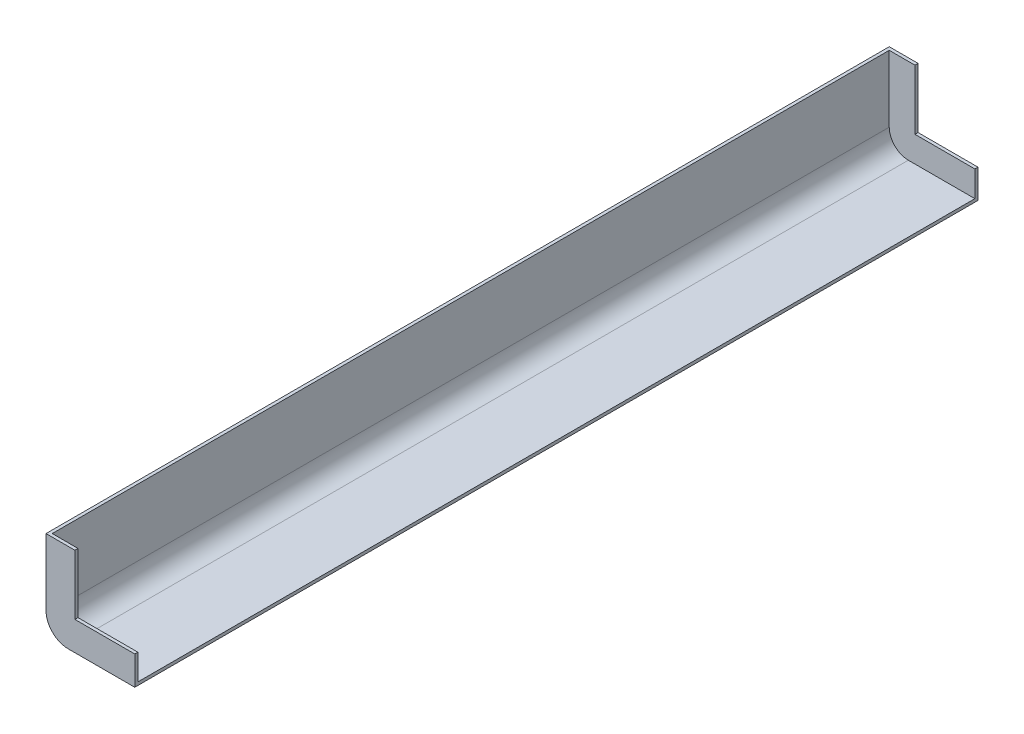
ISO-10303-21;
HEADER;
FILE_DESCRIPTION(('STEP AP214'),'2;1');
FILE_NAME('part.step','',(''),(''),'','','');
FILE_SCHEMA(('AUTOMOTIVE_DESIGN { 1 0 10303 214 1 1 1 1 }'));
ENDSEC;
DATA;
#1=APPLICATION_CONTEXT('core data for automotive mechanical design processes');
#2=APPLICATION_PROTOCOL_DEFINITION('international standard','automotive_design',2000,#1);
#3=PRODUCT_CONTEXT('',#1,'mechanical');
#4=PRODUCT('Part','Part','',(#3));
#5=PRODUCT_RELATED_PRODUCT_CATEGORY('part','',(#4));
#6=PRODUCT_DEFINITION_FORMATION('','',#4);
#7=PRODUCT_DEFINITION_CONTEXT('part definition',#1,'design');
#8=PRODUCT_DEFINITION('design','',#6,#7);
#9=PRODUCT_DEFINITION_SHAPE('','',#8);
#10=(LENGTH_UNIT() NAMED_UNIT(*) SI_UNIT(.MILLI.,.METRE.));
#11=(NAMED_UNIT(*) PLANE_ANGLE_UNIT() SI_UNIT($,.RADIAN.));
#12=(NAMED_UNIT(*) SI_UNIT($,.STERADIAN.) SOLID_ANGLE_UNIT());
#13=UNCERTAINTY_MEASURE_WITH_UNIT(LENGTH_MEASURE(1.E-05),#10,'distance_accuracy_value','');
#14=(GEOMETRIC_REPRESENTATION_CONTEXT(3) GLOBAL_UNCERTAINTY_ASSIGNED_CONTEXT((#13)) GLOBAL_UNIT_ASSIGNED_CONTEXT((#10,
#11,#12)) REPRESENTATION_CONTEXT('',''));
#15=CARTESIAN_POINT('',(0.,0.,0.));
#16=DIRECTION('',(0.,0.,1.));
#17=DIRECTION('',(1.,0.,0.));
#18=AXIS2_PLACEMENT_3D('',#15,#16,#17);
#19=CARTESIAN_POINT('',(16.51,50.8,482.6));
#20=DIRECTION('',(0.,-1.,0.));
#21=DIRECTION('',(0.,0.,-1.));
#22=AXIS2_PLACEMENT_3D('',#19,#20,#21);
#23=PLANE('',#22);
#24=DIRECTION('',(-1.,0.,0.));
#25=VECTOR('',#24,1.);
#26=CARTESIAN_POINT('',(16.51,50.8,1.778));
#27=LINE('',#26,#25);
#28=CARTESIAN_POINT('',(16.51,50.8,1.778));
#29=VERTEX_POINT('',#28);
#30=CARTESIAN_POINT('',(1.778,50.8,1.778));
#31=VERTEX_POINT('',#30);
#32=EDGE_CURVE('E237',#29,#31,#27,.T.);
#33=ORIENTED_EDGE('',*,*,#32,.F.);
#34=DIRECTION('',(0.,0.,-1.));
#35=VECTOR('',#34,1.);
#36=CARTESIAN_POINT('',(16.51,50.8,482.6));
#37=LINE('',#36,#35);
#38=CARTESIAN_POINT('',(16.51,50.8,0.));
#39=VERTEX_POINT('',#38);
#40=EDGE_CURVE('E94',#29,#39,#37,.T.);
#41=ORIENTED_EDGE('',*,*,#40,.T.);
#42=DIRECTION('',(-1.,0.,0.));
#43=VECTOR('',#42,1.);
#44=CARTESIAN_POINT('',(16.51,50.8,0.));
#45=LINE('',#44,#43);
#46=CARTESIAN_POINT('',(0.,50.8,0.));
#47=VERTEX_POINT('',#46);
#48=EDGE_CURVE('E152',#39,#47,#45,.T.);
#49=ORIENTED_EDGE('',*,*,#48,.T.);
#50=DIRECTION('',(0.,0.,-1.));
#51=VECTOR('',#50,1.);
#52=CARTESIAN_POINT('',(0.,50.8,482.6));
#53=LINE('',#52,#51);
#54=CARTESIAN_POINT('',(0.,50.8,482.6));
#55=VERTEX_POINT('',#54);
#56=EDGE_CURVE('E11',#55,#47,#53,.T.);
#57=ORIENTED_EDGE('',*,*,#56,.F.);
#58=DIRECTION('',(-1.,0.,0.));
#59=VECTOR('',#58,1.);
#60=CARTESIAN_POINT('',(16.51,50.8,482.6));
#61=LINE('',#60,#59);
#62=CARTESIAN_POINT('',(16.51,50.8,482.6));
#63=VERTEX_POINT('',#62);
#64=EDGE_CURVE('E176',#63,#55,#61,.T.);
#65=ORIENTED_EDGE('',*,*,#64,.F.);
#66=CARTESIAN_POINT('',(16.51,50.8,480.822));
#67=VERTEX_POINT('',#66);
#68=EDGE_CURVE('E177',#63,#67,#37,.T.);
#69=ORIENTED_EDGE('',*,*,#68,.T.);
#70=DIRECTION('',(-1.,0.,0.));
#71=VECTOR('',#70,1.);
#72=CARTESIAN_POINT('',(16.51,50.8,480.822));
#73=LINE('',#72,#71);
#74=CARTESIAN_POINT('',(1.778,50.8,480.822));
#75=VERTEX_POINT('',#74);
#76=EDGE_CURVE('E54',#67,#75,#73,.T.);
#77=ORIENTED_EDGE('',*,*,#76,.T.);
#78=DIRECTION('',(0.,0.,-1.));
#79=VECTOR('',#78,1.);
#80=CARTESIAN_POINT('',(1.778,50.8,482.6));
#81=LINE('',#80,#79);
#82=EDGE_CURVE('E156',#75,#31,#81,.T.);
#83=ORIENTED_EDGE('',*,*,#82,.T.);
#84=EDGE_LOOP('',(#33,#41,#49,#57,#65,#69,#77,#83));
#85=FACE_BOUND('',#84,.T.);
#86=ADVANCED_FACE('F39',(#85),#23,.F.);
#87=CARTESIAN_POINT('',(50.8,0.,482.6));
#88=DIRECTION('',(-1.,0.,0.));
#89=DIRECTION('',(0.,0.,1.));
#90=AXIS2_PLACEMENT_3D('',#87,#88,#89);
#91=PLANE('',#90);
#92=DIRECTION('',(0.,1.,0.));
#93=VECTOR('',#92,1.);
#94=CARTESIAN_POINT('',(50.8,0.,1.778));
#95=LINE('',#94,#93);
#96=CARTESIAN_POINT('',(50.8,1.778,1.778));
#97=VERTEX_POINT('',#96);
#98=CARTESIAN_POINT('',(50.8,16.51,1.778));
#99=VERTEX_POINT('',#98);
#100=EDGE_CURVE('E233',#97,#99,#95,.T.);
#101=ORIENTED_EDGE('',*,*,#100,.F.);
#102=DIRECTION('',(0.,0.,-1.));
#103=VECTOR('',#102,1.);
#104=CARTESIAN_POINT('',(50.8,1.778,482.6));
#105=LINE('',#104,#103);
#106=CARTESIAN_POINT('',(50.8,1.778,480.822));
#107=VERTEX_POINT('',#106);
#108=EDGE_CURVE('E258',#107,#97,#105,.T.);
#109=ORIENTED_EDGE('',*,*,#108,.F.);
#110=DIRECTION('',(0.,1.,0.));
#111=VECTOR('',#110,1.);
#112=CARTESIAN_POINT('',(50.8,0.,480.822));
#113=LINE('',#112,#111);
#114=CARTESIAN_POINT('',(50.8,16.51,480.822));
#115=VERTEX_POINT('',#114);
#116=EDGE_CURVE('E136',#107,#115,#113,.T.);
#117=ORIENTED_EDGE('',*,*,#116,.T.);
#118=DIRECTION('',(0.,0.,-1.));
#119=VECTOR('',#118,1.);
#120=CARTESIAN_POINT('',(50.8,16.51,482.6));
#121=LINE('',#120,#119);
#122=CARTESIAN_POINT('',(50.8,16.51,482.6));
#123=VERTEX_POINT('',#122);
#124=EDGE_CURVE('E130',#123,#115,#121,.T.);
#125=ORIENTED_EDGE('',*,*,#124,.F.);
#126=DIRECTION('',(0.,1.,0.));
#127=VECTOR('',#126,1.);
#128=CARTESIAN_POINT('',(50.8,0.,482.6));
#129=LINE('',#128,#127);
#130=CARTESIAN_POINT('',(50.8,0.,482.6));
#131=VERTEX_POINT('',#130);
#132=EDGE_CURVE('E115',#131,#123,#129,.T.);
#133=ORIENTED_EDGE('',*,*,#132,.F.);
#134=DIRECTION('',(0.,0.,-1.));
#135=VECTOR('',#134,1.);
#136=CARTESIAN_POINT('',(50.8,0.,482.6));
#137=LINE('',#136,#135);
#138=CARTESIAN_POINT('',(50.8,0.,0.));
#139=VERTEX_POINT('',#138);
#140=EDGE_CURVE('E140',#131,#139,#137,.T.);
#141=ORIENTED_EDGE('',*,*,#140,.T.);
#142=DIRECTION('',(0.,1.,0.));
#143=VECTOR('',#142,1.);
#144=CARTESIAN_POINT('',(50.8,0.,0.));
#145=LINE('',#144,#143);
#146=CARTESIAN_POINT('',(50.8,16.51,0.));
#147=VERTEX_POINT('',#146);
#148=EDGE_CURVE('E165',#139,#147,#145,.T.);
#149=ORIENTED_EDGE('',*,*,#148,.T.);
#150=EDGE_CURVE('E141',#99,#147,#121,.T.);
#151=ORIENTED_EDGE('',*,*,#150,.F.);
#152=EDGE_LOOP('',(#101,#109,#117,#125,#133,#141,#149,#151));
#153=FACE_BOUND('',#152,.T.);
#154=ADVANCED_FACE('F132',(#153),#91,.F.);
#155=CARTESIAN_POINT('',(50.8,16.51,482.6));
#156=DIRECTION('',(0.,-1.,0.));
#157=DIRECTION('',(1.,0.,0.));
#158=AXIS2_PLACEMENT_3D('',#155,#156,#157);
#159=PLANE('',#158);
#160=DIRECTION('',(-1.,0.,0.));
#161=VECTOR('',#160,1.);
#162=CARTESIAN_POINT('',(50.8,16.51,1.778));
#163=LINE('',#162,#161);
#164=CARTESIAN_POINT('',(16.51,16.51,1.778));
#165=VERTEX_POINT('',#164);
#166=EDGE_CURVE('E214',#99,#165,#163,.T.);
#167=ORIENTED_EDGE('',*,*,#166,.F.);
#168=ORIENTED_EDGE('',*,*,#150,.T.);
#169=DIRECTION('',(-1.,0.,0.));
#170=VECTOR('',#169,1.);
#171=CARTESIAN_POINT('',(50.8,16.51,0.));
#172=LINE('',#171,#170);
#173=CARTESIAN_POINT('',(16.51,16.51,0.));
#174=VERTEX_POINT('',#173);
#175=EDGE_CURVE('E169',#147,#174,#172,.T.);
#176=ORIENTED_EDGE('',*,*,#175,.T.);
#177=DIRECTION('',(0.,0.,-1.));
#178=VECTOR('',#177,1.);
#179=CARTESIAN_POINT('',(16.51,16.51,482.6));
#180=LINE('',#179,#178);
#181=EDGE_CURVE('E181',#165,#174,#180,.T.);
#182=ORIENTED_EDGE('',*,*,#181,.F.);
#183=EDGE_LOOP('',(#167,#168,#176,#182));
#184=FACE_BOUND('',#183,.T.);
#185=ADVANCED_FACE('F211',(#184),#159,.F.);
#186=CARTESIAN_POINT('',(16.51,16.51,482.6));
#187=DIRECTION('',(-1.,0.,0.));
#188=DIRECTION('',(0.,-1.,0.));
#189=AXIS2_PLACEMENT_3D('',#186,#187,#188);
#190=PLANE('',#189);
#191=DIRECTION('',(0.,1.,0.));
#192=VECTOR('',#191,1.);
#193=CARTESIAN_POINT('',(16.51,16.51,1.778));
#194=LINE('',#193,#192);
#195=EDGE_CURVE('E222',#165,#29,#194,.T.);
#196=ORIENTED_EDGE('',*,*,#195,.F.);
#197=ORIENTED_EDGE('',*,*,#181,.T.);
#198=DIRECTION('',(0.,1.,0.));
#199=VECTOR('',#198,1.);
#200=CARTESIAN_POINT('',(16.51,16.51,0.));
#201=LINE('',#200,#199);
#202=EDGE_CURVE('E173',#174,#39,#201,.T.);
#203=ORIENTED_EDGE('',*,*,#202,.T.);
#204=ORIENTED_EDGE('',*,*,#40,.F.);
#205=EDGE_LOOP('',(#196,#197,#203,#204));
#206=FACE_BOUND('',#205,.T.);
#207=ADVANCED_FACE('F220',(#206),#190,.F.);
#208=CARTESIAN_POINT('',(0.,12.7000000000001,482.6));
#209=DIRECTION('',(1.,0.,0.));
#210=DIRECTION('',(0.,0.,-1.));
#211=AXIS2_PLACEMENT_3D('',#208,#209,#210);
#212=PLANE('',#211);
#213=DIRECTION('',(0.,-1.,0.));
#214=VECTOR('',#213,1.);
#215=CARTESIAN_POINT('',(0.,12.7000000000001,0.));
#216=LINE('',#215,#214);
#217=CARTESIAN_POINT('',(0.,12.7000000000001,0.));
#218=VERTEX_POINT('',#217);
#219=EDGE_CURVE('E155',#47,#218,#216,.T.);
#220=ORIENTED_EDGE('',*,*,#219,.T.);
#221=DIRECTION('',(0.,0.,-1.));
#222=VECTOR('',#221,1.);
#223=CARTESIAN_POINT('',(0.,12.7000000000001,482.6));
#224=LINE('',#223,#222);
#225=CARTESIAN_POINT('',(0.,12.7000000000001,482.6));
#226=VERTEX_POINT('',#225);
#227=EDGE_CURVE('E47',#226,#218,#224,.T.);
#228=ORIENTED_EDGE('',*,*,#227,.F.);
#229=DIRECTION('',(0.,-1.,0.));
#230=VECTOR('',#229,1.);
#231=CARTESIAN_POINT('',(0.,12.7000000000001,482.6));
#232=LINE('',#231,#230);
#233=EDGE_CURVE('E102',#55,#226,#232,.T.);
#234=ORIENTED_EDGE('',*,*,#233,.F.);
#235=ORIENTED_EDGE('',*,*,#56,.T.);
#236=EDGE_LOOP('',(#220,#228,#234,#235));
#237=FACE_BOUND('',#236,.T.);
#238=ADVANCED_FACE('F355',(#237),#212,.F.);
#239=CARTESIAN_POINT('',(12.7,12.7,482.6));
#240=DIRECTION('',(0.,0.,-1.));
#241=DIRECTION('',(-1.,0.,0.));
#242=AXIS2_PLACEMENT_3D('',#239,#240,#241);
#243=CYLINDRICAL_SURFACE('',#242,12.7);
#244=CARTESIAN_POINT('',(12.7,12.7,0.));
#245=DIRECTION('',(0.,0.,1.));
#246=DIRECTION('',(1.,0.,0.));
#247=AXIS2_PLACEMENT_3D('',#244,#245,#246);
#248=CIRCLE('',#247,12.7);
#249=CARTESIAN_POINT('',(12.7000000000001,0.,0.));
#250=VERTEX_POINT('',#249);
#251=EDGE_CURVE('E159',#218,#250,#248,.T.);
#252=ORIENTED_EDGE('',*,*,#251,.T.);
#253=DIRECTION('',(0.,0.,-1.));
#254=VECTOR('',#253,1.);
#255=CARTESIAN_POINT('',(12.7000000000001,0.,482.6));
#256=LINE('',#255,#254);
#257=CARTESIAN_POINT('',(12.7000000000001,0.,482.6));
#258=VERTEX_POINT('',#257);
#259=EDGE_CURVE('E186',#258,#250,#256,.T.);
#260=ORIENTED_EDGE('',*,*,#259,.F.);
#261=CARTESIAN_POINT('',(12.7,12.7,482.6));
#262=DIRECTION('',(0.,0.,1.));
#263=DIRECTION('',(1.,0.,0.));
#264=AXIS2_PLACEMENT_3D('',#261,#262,#263);
#265=CIRCLE('',#264,12.7);
#266=EDGE_CURVE('E196',#226,#258,#265,.T.);
#267=ORIENTED_EDGE('',*,*,#266,.F.);
#268=ORIENTED_EDGE('',*,*,#227,.T.);
#269=EDGE_LOOP('',(#252,#260,#267,#268));
#270=FACE_BOUND('',#269,.T.);
#271=ADVANCED_FACE('F194',(#270),#243,.T.);
#272=CARTESIAN_POINT('',(12.7000000000001,0.,482.6));
#273=DIRECTION('',(0.,1.,0.));
#274=DIRECTION('',(0.,0.,1.));
#275=AXIS2_PLACEMENT_3D('',#272,#273,#274);
#276=PLANE('',#275);
#277=DIRECTION('',(1.,0.,0.));
#278=VECTOR('',#277,1.);
#279=CARTESIAN_POINT('',(12.7000000000001,0.,0.));
#280=LINE('',#279,#278);
#281=EDGE_CURVE('E162',#250,#139,#280,.T.);
#282=ORIENTED_EDGE('',*,*,#281,.T.);
#283=ORIENTED_EDGE('',*,*,#140,.F.);
#284=DIRECTION('',(1.,0.,0.));
#285=VECTOR('',#284,1.);
#286=CARTESIAN_POINT('',(12.7000000000001,0.,482.6));
#287=LINE('',#286,#285);
#288=EDGE_CURVE('E122',#258,#131,#287,.T.);
#289=ORIENTED_EDGE('',*,*,#288,.F.);
#290=ORIENTED_EDGE('',*,*,#259,.T.);
#291=EDGE_LOOP('',(#282,#283,#289,#290));
#292=FACE_BOUND('',#291,.T.);
#293=ADVANCED_FACE('F204',(#292),#276,.F.);
#294=ORIENTED_EDGE('',*,*,#124,.T.);
#295=DIRECTION('',(-1.,0.,0.));
#296=VECTOR('',#295,1.);
#297=CARTESIAN_POINT('',(50.8,16.51,480.822));
#298=LINE('',#297,#296);
#299=CARTESIAN_POINT('',(16.51,16.51,480.822));
#300=VERTEX_POINT('',#299);
#301=EDGE_CURVE('E265',#115,#300,#298,.T.);
#302=ORIENTED_EDGE('',*,*,#301,.T.);
#303=CARTESIAN_POINT('',(16.51,16.51,482.6));
#304=VERTEX_POINT('',#303);
#305=EDGE_CURVE('E145',#304,#300,#180,.T.);
#306=ORIENTED_EDGE('',*,*,#305,.F.);
#307=DIRECTION('',(-1.,0.,0.));
#308=VECTOR('',#307,1.);
#309=CARTESIAN_POINT('',(50.8,16.51,482.6));
#310=LINE('',#309,#308);
#311=EDGE_CURVE('E119',#123,#304,#310,.T.);
#312=ORIENTED_EDGE('',*,*,#311,.F.);
#313=EDGE_LOOP('',(#294,#302,#306,#312));
#314=FACE_BOUND('',#313,.T.);
#315=ADVANCED_FACE('F143',(#314),#159,.F.);
#316=ORIENTED_EDGE('',*,*,#305,.T.);
#317=DIRECTION('',(0.,1.,0.));
#318=VECTOR('',#317,1.);
#319=CARTESIAN_POINT('',(16.51,16.51,480.822));
#320=LINE('',#319,#318);
#321=EDGE_CURVE('E262',#300,#67,#320,.T.);
#322=ORIENTED_EDGE('',*,*,#321,.T.);
#323=ORIENTED_EDGE('',*,*,#68,.F.);
#324=DIRECTION('',(0.,1.,0.));
#325=VECTOR('',#324,1.);
#326=CARTESIAN_POINT('',(16.51,16.51,482.6));
#327=LINE('',#326,#325);
#328=EDGE_CURVE('E63',#304,#63,#327,.T.);
#329=ORIENTED_EDGE('',*,*,#328,.F.);
#330=EDGE_LOOP('',(#316,#322,#323,#329));
#331=FACE_BOUND('',#330,.T.);
#332=ADVANCED_FACE('F344',(#331),#190,.F.);
#333=CARTESIAN_POINT('',(12.7,12.7,482.6));
#334=DIRECTION('',(0.,0.,1.));
#335=DIRECTION('',(1.,0.,0.));
#336=AXIS2_PLACEMENT_3D('',#333,#334,#335);
#337=PLANE('',#336);
#338=ORIENTED_EDGE('',*,*,#64,.T.);
#339=ORIENTED_EDGE('',*,*,#233,.T.);
#340=ORIENTED_EDGE('',*,*,#266,.T.);
#341=ORIENTED_EDGE('',*,*,#288,.T.);
#342=ORIENTED_EDGE('',*,*,#132,.T.);
#343=ORIENTED_EDGE('',*,*,#311,.T.);
#344=ORIENTED_EDGE('',*,*,#328,.T.);
#345=EDGE_LOOP('',(#338,#339,#340,#341,#342,#343,#344));
#346=FACE_BOUND('',#345,.T.);
#347=ADVANCED_FACE('F117',(#346),#337,.T.);
#348=CARTESIAN_POINT('',(12.7,12.7,0.));
#349=DIRECTION('',(0.,0.,1.));
#350=DIRECTION('',(1.,0.,0.));
#351=AXIS2_PLACEMENT_3D('',#348,#349,#350);
#352=PLANE('',#351);
#353=ORIENTED_EDGE('',*,*,#48,.F.);
#354=ORIENTED_EDGE('',*,*,#202,.F.);
#355=ORIENTED_EDGE('',*,*,#175,.F.);
#356=ORIENTED_EDGE('',*,*,#148,.F.);
#357=ORIENTED_EDGE('',*,*,#281,.F.);
#358=ORIENTED_EDGE('',*,*,#251,.F.);
#359=ORIENTED_EDGE('',*,*,#219,.F.);
#360=EDGE_LOOP('',(#353,#354,#355,#356,#357,#358,#359));
#361=FACE_BOUND('',#360,.T.);
#362=ADVANCED_FACE('F200',(#361),#352,.F.);
#363=CARTESIAN_POINT('',(1.778,12.7000000000001,482.6));
#364=DIRECTION('',(1.,0.,0.));
#365=DIRECTION('',(0.,0.,-1.));
#366=AXIS2_PLACEMENT_3D('',#363,#364,#365);
#367=PLANE('',#366);
#368=DIRECTION('',(0.,-1.,0.));
#369=VECTOR('',#368,1.);
#370=CARTESIAN_POINT('',(1.778,12.7000000000001,1.778));
#371=LINE('',#370,#369);
#372=CARTESIAN_POINT('',(1.778,12.7000000000001,1.778));
#373=VERTEX_POINT('',#372);
#374=EDGE_CURVE('E240',#31,#373,#371,.T.);
#375=ORIENTED_EDGE('',*,*,#374,.F.);
#376=ORIENTED_EDGE('',*,*,#82,.F.);
#377=DIRECTION('',(0.,-1.,0.));
#378=VECTOR('',#377,1.);
#379=CARTESIAN_POINT('',(1.778,12.7000000000001,480.822));
#380=LINE('',#379,#378);
#381=CARTESIAN_POINT('',(1.778,12.7000000000001,480.822));
#382=VERTEX_POINT('',#381);
#383=EDGE_CURVE('E231',#75,#382,#380,.T.);
#384=ORIENTED_EDGE('',*,*,#383,.T.);
#385=DIRECTION('',(0.,0.,-1.));
#386=VECTOR('',#385,1.);
#387=CARTESIAN_POINT('',(1.778,12.7000000000001,482.6));
#388=LINE('',#387,#386);
#389=EDGE_CURVE('E250',#382,#373,#388,.T.);
#390=ORIENTED_EDGE('',*,*,#389,.T.);
#391=EDGE_LOOP('',(#375,#376,#384,#390));
#392=FACE_BOUND('',#391,.T.);
#393=ADVANCED_FACE('F339',(#392),#367,.T.);
#394=CARTESIAN_POINT('',(12.7,12.7,482.6));
#395=DIRECTION('',(0.,0.,-1.));
#396=DIRECTION('',(-1.,0.,0.));
#397=AXIS2_PLACEMENT_3D('',#394,#395,#396);
#398=CYLINDRICAL_SURFACE('',#397,10.922);
#399=CARTESIAN_POINT('',(12.7,12.7,1.778));
#400=DIRECTION('',(0.,0.,1.));
#401=DIRECTION('',(1.,0.,0.));
#402=AXIS2_PLACEMENT_3D('',#399,#400,#401);
#403=CIRCLE('',#402,10.922);
#404=CARTESIAN_POINT('',(12.7000000000001,1.778,1.778));
#405=VERTEX_POINT('',#404);
#406=EDGE_CURVE('E287',#373,#405,#403,.T.);
#407=ORIENTED_EDGE('',*,*,#406,.F.);
#408=ORIENTED_EDGE('',*,*,#389,.F.);
#409=CARTESIAN_POINT('',(12.7,12.7,480.822));
#410=DIRECTION('',(0.,0.,1.));
#411=DIRECTION('',(1.,0.,0.));
#412=AXIS2_PLACEMENT_3D('',#409,#410,#411);
#413=CIRCLE('',#412,10.922);
#414=CARTESIAN_POINT('',(12.7000000000001,1.778,480.822));
#415=VERTEX_POINT('',#414);
#416=EDGE_CURVE('E274',#382,#415,#413,.T.);
#417=ORIENTED_EDGE('',*,*,#416,.T.);
#418=DIRECTION('',(0.,0.,1.));
#419=VECTOR('',#418,1.);
#420=CARTESIAN_POINT('',(12.7000000000001,1.778,482.6));
#421=LINE('',#420,#419);
#422=EDGE_CURVE('E254',#415,#405,#421,.F.);
#423=ORIENTED_EDGE('',*,*,#422,.T.);
#424=EDGE_LOOP('',(#407,#408,#417,#423));
#425=FACE_BOUND('',#424,.T.);
#426=ADVANCED_FACE('F320',(#425),#398,.F.);
#427=CARTESIAN_POINT('',(12.7000000000001,1.778,482.6));
#428=DIRECTION('',(0.,1.,0.));
#429=DIRECTION('',(0.,0.,1.));
#430=AXIS2_PLACEMENT_3D('',#427,#428,#429);
#431=PLANE('',#430);
#432=DIRECTION('',(1.,0.,0.));
#433=VECTOR('',#432,1.);
#434=CARTESIAN_POINT('',(12.7000000000001,1.778,1.778));
#435=LINE('',#434,#433);
#436=EDGE_CURVE('E290',#405,#97,#435,.T.);
#437=ORIENTED_EDGE('',*,*,#436,.F.);
#438=ORIENTED_EDGE('',*,*,#422,.F.);
#439=DIRECTION('',(1.,0.,0.));
#440=VECTOR('',#439,1.);
#441=CARTESIAN_POINT('',(12.7000000000001,1.778,480.822));
#442=LINE('',#441,#440);
#443=EDGE_CURVE('E270',#415,#107,#442,.T.);
#444=ORIENTED_EDGE('',*,*,#443,.T.);
#445=ORIENTED_EDGE('',*,*,#108,.T.);
#446=EDGE_LOOP('',(#437,#438,#444,#445));
#447=FACE_BOUND('',#446,.T.);
#448=ADVANCED_FACE('F321',(#447),#431,.T.);
#449=CARTESIAN_POINT('',(12.7,12.7,480.822));
#450=DIRECTION('',(0.,0.,1.));
#451=DIRECTION('',(1.,0.,0.));
#452=AXIS2_PLACEMENT_3D('',#449,#450,#451);
#453=PLANE('',#452);
#454=ORIENTED_EDGE('',*,*,#76,.F.);
#455=ORIENTED_EDGE('',*,*,#321,.F.);
#456=ORIENTED_EDGE('',*,*,#301,.F.);
#457=ORIENTED_EDGE('',*,*,#116,.F.);
#458=ORIENTED_EDGE('',*,*,#443,.F.);
#459=ORIENTED_EDGE('',*,*,#416,.F.);
#460=ORIENTED_EDGE('',*,*,#383,.F.);
#461=EDGE_LOOP('',(#454,#455,#456,#457,#458,#459,#460));
#462=FACE_BOUND('',#461,.T.);
#463=ADVANCED_FACE('F322',(#462),#453,.F.);
#464=CARTESIAN_POINT('',(12.7,12.7,1.778));
#465=DIRECTION('',(0.,0.,1.));
#466=DIRECTION('',(1.,0.,0.));
#467=AXIS2_PLACEMENT_3D('',#464,#465,#466);
#468=PLANE('',#467);
#469=ORIENTED_EDGE('',*,*,#32,.T.);
#470=ORIENTED_EDGE('',*,*,#374,.T.);
#471=ORIENTED_EDGE('',*,*,#406,.T.);
#472=ORIENTED_EDGE('',*,*,#436,.T.);
#473=ORIENTED_EDGE('',*,*,#100,.T.);
#474=ORIENTED_EDGE('',*,*,#166,.T.);
#475=ORIENTED_EDGE('',*,*,#195,.T.);
#476=EDGE_LOOP('',(#469,#470,#471,#472,#473,#474,#475));
#477=FACE_BOUND('',#476,.T.);
#478=ADVANCED_FACE('F296',(#477),#468,.T.);
#479=CLOSED_SHELL('',(#86,#154,#185,#207,#238,#271,#293,#315,#332,#347,#362,#393,#426,#448,#463,#478));
#480=MANIFOLD_SOLID_BREP('B2',#479);
#481=ADVANCED_BREP_SHAPE_REPRESENTATION('',(#18,#480),#14);
#482=SHAPE_DEFINITION_REPRESENTATION(#9,#481);
ENDSEC;
END-ISO-10303-21;
